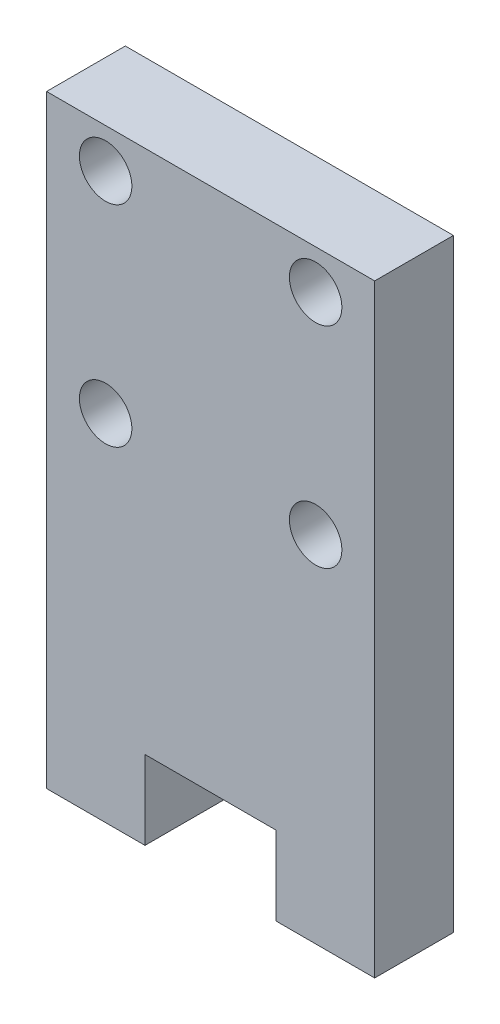
ISO-10303-21;
HEADER;
FILE_DESCRIPTION(('STEP AP214'),'2;1');
FILE_NAME('part.step','',(''),(''),'','','');
FILE_SCHEMA(('AUTOMOTIVE_DESIGN { 1 0 10303 214 1 1 1 1 }'));
ENDSEC;
DATA;
#1=APPLICATION_CONTEXT('core data for automotive mechanical design processes');
#2=APPLICATION_PROTOCOL_DEFINITION('international standard','automotive_design',2000,#1);
#3=PRODUCT_CONTEXT('',#1,'mechanical');
#4=PRODUCT('Part','Part','',(#3));
#5=PRODUCT_RELATED_PRODUCT_CATEGORY('part','',(#4));
#6=PRODUCT_DEFINITION_FORMATION('','',#4);
#7=PRODUCT_DEFINITION_CONTEXT('part definition',#1,'design');
#8=PRODUCT_DEFINITION('design','',#6,#7);
#9=PRODUCT_DEFINITION_SHAPE('','',#8);
#10=(LENGTH_UNIT() NAMED_UNIT(*) SI_UNIT(.MILLI.,.METRE.));
#11=(NAMED_UNIT(*) PLANE_ANGLE_UNIT() SI_UNIT($,.RADIAN.));
#12=(NAMED_UNIT(*) SI_UNIT($,.STERADIAN.) SOLID_ANGLE_UNIT());
#13=UNCERTAINTY_MEASURE_WITH_UNIT(LENGTH_MEASURE(1.E-05),#10,'distance_accuracy_value','');
#14=(GEOMETRIC_REPRESENTATION_CONTEXT(3) GLOBAL_UNCERTAINTY_ASSIGNED_CONTEXT((#13)) GLOBAL_UNIT_ASSIGNED_CONTEXT((#10,
#11,#12)) REPRESENTATION_CONTEXT('',''));
#15=CARTESIAN_POINT('',(0.,0.,0.));
#16=DIRECTION('',(0.,0.,1.));
#17=DIRECTION('',(1.,0.,0.));
#18=AXIS2_PLACEMENT_3D('',#15,#16,#17);
#19=CARTESIAN_POINT('',(0.,0.,6.));
#20=DIRECTION('',(0.,1.,0.));
#21=DIRECTION('',(0.,0.,1.));
#22=AXIS2_PLACEMENT_3D('',#19,#20,#21);
#23=PLANE('',#22);
#24=DIRECTION('',(0.,0.,-1.));
#25=VECTOR('',#24,1.);
#26=CARTESIAN_POINT('',(17.5,0.,0.));
#27=LINE('',#26,#25);
#28=CARTESIAN_POINT('',(17.5,0.,6.));
#29=VERTEX_POINT('',#28);
#30=CARTESIAN_POINT('',(17.5,0.,0.));
#31=VERTEX_POINT('',#30);
#32=EDGE_CURVE('E52',#29,#31,#27,.T.);
#33=ORIENTED_EDGE('',*,*,#32,.F.);
#34=DIRECTION('',(1.,0.,0.));
#35=VECTOR('',#34,1.);
#36=CARTESIAN_POINT('',(0.,0.,6.));
#37=LINE('',#36,#35);
#38=CARTESIAN_POINT('',(7.5,0.,6.));
#39=VERTEX_POINT('',#38);
#40=EDGE_CURVE('E108',#39,#29,#37,.T.);
#41=ORIENTED_EDGE('',*,*,#40,.F.);
#42=DIRECTION('',(0.,0.,1.));
#43=VECTOR('',#42,1.);
#44=CARTESIAN_POINT('',(7.5,0.,0.));
#45=LINE('',#44,#43);
#46=CARTESIAN_POINT('',(7.5,0.,0.));
#47=VERTEX_POINT('',#46);
#48=EDGE_CURVE('E132',#47,#39,#45,.T.);
#49=ORIENTED_EDGE('',*,*,#48,.F.);
#50=DIRECTION('',(1.,0.,0.));
#51=VECTOR('',#50,1.);
#52=CARTESIAN_POINT('',(0.,0.,0.));
#53=LINE('',#52,#51);
#54=EDGE_CURVE('E57',#47,#31,#53,.T.);
#55=ORIENTED_EDGE('',*,*,#54,.T.);
#56=EDGE_LOOP('',(#33,#41,#49,#55));
#57=FACE_BOUND('',#56,.T.);
#58=ADVANCED_FACE('F35',(#57),#23,.F.);
#59=CARTESIAN_POINT('',(20.5,21.,0.));
#60=DIRECTION('',(0.,0.,1.));
#61=DIRECTION('',(1.,0.,0.));
#62=AXIS2_PLACEMENT_3D('',#59,#60,#61);
#63=CYLINDRICAL_SURFACE('',#62,1.005);
#64=CARTESIAN_POINT('',(20.5,21.,0.));
#65=DIRECTION('',(0.,0.,1.));
#66=DIRECTION('',(1.,0.,0.));
#67=AXIS2_PLACEMENT_3D('',#64,#65,#66);
#68=CIRCLE('',#67,1.005);
#69=CARTESIAN_POINT('',(21.505,21.,0.));
#70=VERTEX_POINT('',#69);
#71=EDGE_CURVE('E190',#70,#70,#68,.T.);
#72=ORIENTED_EDGE('',*,*,#71,.F.);
#73=EDGE_LOOP('',(#72));
#74=FACE_BOUND('',#73,.T.);
#75=CARTESIAN_POINT('',(20.5,21.,3.));
#76=DIRECTION('',(0.,0.,1.));
#77=DIRECTION('',(1.,0.,0.));
#78=AXIS2_PLACEMENT_3D('',#75,#76,#77);
#79=CIRCLE('',#78,1.005);
#80=CARTESIAN_POINT('',(21.505,21.,3.));
#81=VERTEX_POINT('',#80);
#82=EDGE_CURVE('E167',#81,#81,#79,.F.);
#83=ORIENTED_EDGE('',*,*,#82,.F.);
#84=EDGE_LOOP('',(#83));
#85=FACE_BOUND('',#84,.T.);
#86=ADVANCED_FACE('F251',(#74,#85),#63,.F.);
#87=CARTESIAN_POINT('',(4.5,21.,0.));
#88=DIRECTION('',(0.,0.,1.));
#89=DIRECTION('',(1.,0.,0.));
#90=AXIS2_PLACEMENT_3D('',#87,#88,#89);
#91=CYLINDRICAL_SURFACE('',#90,1.005);
#92=CARTESIAN_POINT('',(4.5,21.,0.));
#93=DIRECTION('',(0.,0.,1.));
#94=DIRECTION('',(1.,0.,0.));
#95=AXIS2_PLACEMENT_3D('',#92,#93,#94);
#96=CIRCLE('',#95,1.005);
#97=CARTESIAN_POINT('',(5.505,21.,0.));
#98=VERTEX_POINT('',#97);
#99=EDGE_CURVE('E193',#98,#98,#96,.T.);
#100=ORIENTED_EDGE('',*,*,#99,.F.);
#101=EDGE_LOOP('',(#100));
#102=FACE_BOUND('',#101,.T.);
#103=CARTESIAN_POINT('',(4.5,21.,3.));
#104=DIRECTION('',(0.,0.,1.));
#105=DIRECTION('',(1.,0.,0.));
#106=AXIS2_PLACEMENT_3D('',#103,#104,#105);
#107=CIRCLE('',#106,1.005);
#108=CARTESIAN_POINT('',(5.505,21.,3.));
#109=VERTEX_POINT('',#108);
#110=EDGE_CURVE('E172',#109,#109,#107,.F.);
#111=ORIENTED_EDGE('',*,*,#110,.F.);
#112=EDGE_LOOP('',(#111));
#113=FACE_BOUND('',#112,.T.);
#114=ADVANCED_FACE('F255',(#102,#113),#91,.F.);
#115=CARTESIAN_POINT('',(20.5,37.,0.));
#116=DIRECTION('',(0.,0.,1.));
#117=DIRECTION('',(1.,0.,0.));
#118=AXIS2_PLACEMENT_3D('',#115,#116,#117);
#119=CYLINDRICAL_SURFACE('',#118,1.005);
#120=CARTESIAN_POINT('',(20.5,37.,0.));
#121=DIRECTION('',(0.,0.,1.));
#122=DIRECTION('',(1.,0.,0.));
#123=AXIS2_PLACEMENT_3D('',#120,#121,#122);
#124=CIRCLE('',#123,1.005);
#125=CARTESIAN_POINT('',(21.505,37.,0.));
#126=VERTEX_POINT('',#125);
#127=EDGE_CURVE('E196',#126,#126,#124,.T.);
#128=ORIENTED_EDGE('',*,*,#127,.F.);
#129=EDGE_LOOP('',(#128));
#130=FACE_BOUND('',#129,.T.);
#131=CARTESIAN_POINT('',(20.5,37.,3.));
#132=DIRECTION('',(0.,0.,1.));
#133=DIRECTION('',(1.,0.,0.));
#134=AXIS2_PLACEMENT_3D('',#131,#132,#133);
#135=CIRCLE('',#134,1.005);
#136=CARTESIAN_POINT('',(21.505,37.,3.));
#137=VERTEX_POINT('',#136);
#138=EDGE_CURVE('E179',#137,#137,#135,.F.);
#139=ORIENTED_EDGE('',*,*,#138,.F.);
#140=EDGE_LOOP('',(#139));
#141=FACE_BOUND('',#140,.T.);
#142=ADVANCED_FACE('F273',(#130,#141),#119,.F.);
#143=CARTESIAN_POINT('',(4.5,37.,0.));
#144=DIRECTION('',(0.,0.,1.));
#145=DIRECTION('',(1.,0.,0.));
#146=AXIS2_PLACEMENT_3D('',#143,#144,#145);
#147=CYLINDRICAL_SURFACE('',#146,1.005);
#148=CARTESIAN_POINT('',(4.5,37.,0.));
#149=DIRECTION('',(0.,0.,1.));
#150=DIRECTION('',(1.,0.,0.));
#151=AXIS2_PLACEMENT_3D('',#148,#149,#150);
#152=CIRCLE('',#151,1.005);
#153=CARTESIAN_POINT('',(5.505,37.,0.));
#154=VERTEX_POINT('',#153);
#155=EDGE_CURVE('E199',#154,#154,#152,.T.);
#156=ORIENTED_EDGE('',*,*,#155,.F.);
#157=EDGE_LOOP('',(#156));
#158=FACE_BOUND('',#157,.T.);
#159=CARTESIAN_POINT('',(4.5,37.,3.));
#160=DIRECTION('',(0.,0.,1.));
#161=DIRECTION('',(1.,0.,0.));
#162=AXIS2_PLACEMENT_3D('',#159,#160,#161);
#163=CIRCLE('',#162,1.005);
#164=CARTESIAN_POINT('',(5.505,37.,3.));
#165=VERTEX_POINT('',#164);
#166=EDGE_CURVE('E186',#165,#165,#163,.F.);
#167=ORIENTED_EDGE('',*,*,#166,.F.);
#168=EDGE_LOOP('',(#167));
#169=FACE_BOUND('',#168,.T.);
#170=ADVANCED_FACE('F270',(#158,#169),#147,.F.);
#171=CARTESIAN_POINT('',(0.,0.,6.));
#172=DIRECTION('',(1.,0.,0.));
#173=DIRECTION('',(0.,0.,-1.));
#174=AXIS2_PLACEMENT_3D('',#171,#172,#173);
#175=PLANE('',#174);
#176=DIRECTION('',(0.,-1.,0.));
#177=VECTOR('',#176,1.);
#178=CARTESIAN_POINT('',(0.,0.,0.));
#179=LINE('',#178,#177);
#180=CARTESIAN_POINT('',(0.,40.,0.));
#181=VERTEX_POINT('',#180);
#182=CARTESIAN_POINT('',(0.,-6.,0.));
#183=VERTEX_POINT('',#182);
#184=EDGE_CURVE('E202',#181,#183,#179,.T.);
#185=ORIENTED_EDGE('',*,*,#184,.T.);
#186=DIRECTION('',(0.,0.,-1.));
#187=VECTOR('',#186,1.);
#188=CARTESIAN_POINT('',(0.,-6.,0.));
#189=LINE('',#188,#187);
#190=CARTESIAN_POINT('',(0.,-6.,6.));
#191=VERTEX_POINT('',#190);
#192=EDGE_CURVE('E133',#191,#183,#189,.T.);
#193=ORIENTED_EDGE('',*,*,#192,.F.);
#194=DIRECTION('',(0.,-1.,0.));
#195=VECTOR('',#194,1.);
#196=CARTESIAN_POINT('',(0.,0.,6.));
#197=LINE('',#196,#195);
#198=CARTESIAN_POINT('',(0.,40.,6.));
#199=VERTEX_POINT('',#198);
#200=EDGE_CURVE('E203',#199,#191,#197,.T.);
#201=ORIENTED_EDGE('',*,*,#200,.F.);
#202=DIRECTION('',(0.,0.,-1.));
#203=VECTOR('',#202,1.);
#204=CARTESIAN_POINT('',(0.,40.,6.));
#205=LINE('',#204,#203);
#206=EDGE_CURVE('E44',#199,#181,#205,.T.);
#207=ORIENTED_EDGE('',*,*,#206,.T.);
#208=EDGE_LOOP('',(#185,#193,#201,#207));
#209=FACE_BOUND('',#208,.T.);
#210=ADVANCED_FACE('F37',(#209),#175,.F.);
#211=CARTESIAN_POINT('',(25.,0.,6.));
#212=DIRECTION('',(-1.,0.,0.));
#213=DIRECTION('',(0.,0.,1.));
#214=AXIS2_PLACEMENT_3D('',#211,#212,#213);
#215=PLANE('',#214);
#216=DIRECTION('',(0.,1.,0.));
#217=VECTOR('',#216,1.);
#218=CARTESIAN_POINT('',(25.,0.,0.));
#219=LINE('',#218,#217);
#220=CARTESIAN_POINT('',(25.,-6.,0.));
#221=VERTEX_POINT('',#220);
#222=CARTESIAN_POINT('',(25.,40.,0.));
#223=VERTEX_POINT('',#222);
#224=EDGE_CURVE('E211',#221,#223,#219,.T.);
#225=ORIENTED_EDGE('',*,*,#224,.T.);
#226=DIRECTION('',(0.,0.,-1.));
#227=VECTOR('',#226,1.);
#228=CARTESIAN_POINT('',(25.,40.,6.));
#229=LINE('',#228,#227);
#230=CARTESIAN_POINT('',(25.,40.,6.));
#231=VERTEX_POINT('',#230);
#232=EDGE_CURVE('E11',#231,#223,#229,.T.);
#233=ORIENTED_EDGE('',*,*,#232,.F.);
#234=DIRECTION('',(0.,1.,0.));
#235=VECTOR('',#234,1.);
#236=CARTESIAN_POINT('',(25.,0.,6.));
#237=LINE('',#236,#235);
#238=CARTESIAN_POINT('',(25.,-6.,6.));
#239=VERTEX_POINT('',#238);
#240=EDGE_CURVE('E100',#239,#231,#237,.T.);
#241=ORIENTED_EDGE('',*,*,#240,.F.);
#242=DIRECTION('',(0.,0.,1.));
#243=VECTOR('',#242,1.);
#244=CARTESIAN_POINT('',(25.,-6.,0.));
#245=LINE('',#244,#243);
#246=EDGE_CURVE('E104',#221,#239,#245,.T.);
#247=ORIENTED_EDGE('',*,*,#246,.F.);
#248=EDGE_LOOP('',(#225,#233,#241,#247));
#249=FACE_BOUND('',#248,.T.);
#250=ADVANCED_FACE('F102',(#249),#215,.F.);
#251=CARTESIAN_POINT('',(0.,40.,6.));
#252=DIRECTION('',(0.,-1.,0.));
#253=DIRECTION('',(0.,0.,-1.));
#254=AXIS2_PLACEMENT_3D('',#251,#252,#253);
#255=PLANE('',#254);
#256=DIRECTION('',(-1.,0.,0.));
#257=VECTOR('',#256,1.);
#258=CARTESIAN_POINT('',(0.,40.,0.));
#259=LINE('',#258,#257);
#260=EDGE_CURVE('E204',#223,#181,#259,.T.);
#261=ORIENTED_EDGE('',*,*,#260,.T.);
#262=ORIENTED_EDGE('',*,*,#206,.F.);
#263=DIRECTION('',(-1.,0.,0.));
#264=VECTOR('',#263,1.);
#265=CARTESIAN_POINT('',(0.,40.,6.));
#266=LINE('',#265,#264);
#267=EDGE_CURVE('E107',#231,#199,#266,.T.);
#268=ORIENTED_EDGE('',*,*,#267,.F.);
#269=ORIENTED_EDGE('',*,*,#232,.T.);
#270=EDGE_LOOP('',(#261,#262,#268,#269));
#271=FACE_BOUND('',#270,.T.);
#272=ADVANCED_FACE('F227',(#271),#255,.F.);
#273=CARTESIAN_POINT('',(0.,0.,6.));
#274=DIRECTION('',(0.,0.,-1.));
#275=DIRECTION('',(-1.,0.,0.));
#276=AXIS2_PLACEMENT_3D('',#273,#274,#275);
#277=PLANE('',#276);
#278=CARTESIAN_POINT('',(20.5,21.,6.));
#279=DIRECTION('',(0.,0.,1.));
#280=DIRECTION('',(1.,0.,0.));
#281=AXIS2_PLACEMENT_3D('',#278,#279,#280);
#282=CIRCLE('',#281,2.);
#283=CARTESIAN_POINT('',(22.5,21.,6.));
#284=VERTEX_POINT('',#283);
#285=EDGE_CURVE('E159',#284,#284,#282,.T.);
#286=ORIENTED_EDGE('',*,*,#285,.F.);
#287=EDGE_LOOP('',(#286));
#288=FACE_BOUND('',#287,.T.);
#289=CARTESIAN_POINT('',(4.5,21.,6.));
#290=DIRECTION('',(0.,0.,1.));
#291=DIRECTION('',(1.,0.,0.));
#292=AXIS2_PLACEMENT_3D('',#289,#290,#291);
#293=CIRCLE('',#292,2.);
#294=CARTESIAN_POINT('',(6.5,21.,6.));
#295=VERTEX_POINT('',#294);
#296=EDGE_CURVE('E173',#295,#295,#293,.T.);
#297=ORIENTED_EDGE('',*,*,#296,.F.);
#298=EDGE_LOOP('',(#297));
#299=FACE_BOUND('',#298,.T.);
#300=CARTESIAN_POINT('',(20.5,37.,6.));
#301=DIRECTION('',(0.,0.,1.));
#302=DIRECTION('',(1.,0.,0.));
#303=AXIS2_PLACEMENT_3D('',#300,#301,#302);
#304=CIRCLE('',#303,2.);
#305=CARTESIAN_POINT('',(22.5,37.,6.));
#306=VERTEX_POINT('',#305);
#307=EDGE_CURVE('E180',#306,#306,#304,.T.);
#308=ORIENTED_EDGE('',*,*,#307,.F.);
#309=EDGE_LOOP('',(#308));
#310=FACE_BOUND('',#309,.T.);
#311=CARTESIAN_POINT('',(4.5,37.,6.));
#312=DIRECTION('',(0.,0.,1.));
#313=DIRECTION('',(1.,0.,0.));
#314=AXIS2_PLACEMENT_3D('',#311,#312,#313);
#315=CIRCLE('',#314,2.);
#316=CARTESIAN_POINT('',(6.5,37.,6.));
#317=VERTEX_POINT('',#316);
#318=EDGE_CURVE('E187',#317,#317,#315,.T.);
#319=ORIENTED_EDGE('',*,*,#318,.F.);
#320=EDGE_LOOP('',(#319));
#321=FACE_BOUND('',#320,.T.);
#322=ORIENTED_EDGE('',*,*,#200,.T.);
#323=DIRECTION('',(-1.,0.,0.));
#324=VECTOR('',#323,1.);
#325=CARTESIAN_POINT('',(0.,-6.,6.));
#326=LINE('',#325,#324);
#327=CARTESIAN_POINT('',(7.5,-6.,6.));
#328=VERTEX_POINT('',#327);
#329=EDGE_CURVE('E140',#328,#191,#326,.T.);
#330=ORIENTED_EDGE('',*,*,#329,.F.);
#331=DIRECTION('',(0.,1.,0.));
#332=VECTOR('',#331,1.);
#333=CARTESIAN_POINT('',(7.5,-6.,6.));
#334=LINE('',#333,#332);
#335=EDGE_CURVE('E143',#328,#39,#334,.T.);
#336=ORIENTED_EDGE('',*,*,#335,.T.);
#337=ORIENTED_EDGE('',*,*,#40,.T.);
#338=DIRECTION('',(0.,1.,0.));
#339=VECTOR('',#338,1.);
#340=CARTESIAN_POINT('',(17.5,-6.,6.));
#341=LINE('',#340,#339);
#342=CARTESIAN_POINT('',(17.5,-6.,6.));
#343=VERTEX_POINT('',#342);
#344=EDGE_CURVE('E114',#343,#29,#341,.T.);
#345=ORIENTED_EDGE('',*,*,#344,.F.);
#346=DIRECTION('',(-1.,0.,0.));
#347=VECTOR('',#346,1.);
#348=CARTESIAN_POINT('',(25.,-6.,6.));
#349=LINE('',#348,#347);
#350=EDGE_CURVE('E111',#239,#343,#349,.T.);
#351=ORIENTED_EDGE('',*,*,#350,.F.);
#352=ORIENTED_EDGE('',*,*,#240,.T.);
#353=ORIENTED_EDGE('',*,*,#267,.T.);
#354=EDGE_LOOP('',(#322,#330,#336,#337,#345,#351,#352,#353));
#355=FACE_BOUND('',#354,.T.);
#356=ADVANCED_FACE('F112',(#288,#299,#310,#321,#355),#277,.F.);
#357=CARTESIAN_POINT('',(0.,0.,0.));
#358=DIRECTION('',(0.,0.,-1.));
#359=DIRECTION('',(-1.,0.,0.));
#360=AXIS2_PLACEMENT_3D('',#357,#358,#359);
#361=PLANE('',#360);
#362=ORIENTED_EDGE('',*,*,#71,.T.);
#363=EDGE_LOOP('',(#362));
#364=FACE_BOUND('',#363,.T.);
#365=ORIENTED_EDGE('',*,*,#99,.T.);
#366=EDGE_LOOP('',(#365));
#367=FACE_BOUND('',#366,.T.);
#368=ORIENTED_EDGE('',*,*,#127,.T.);
#369=EDGE_LOOP('',(#368));
#370=FACE_BOUND('',#369,.T.);
#371=ORIENTED_EDGE('',*,*,#155,.T.);
#372=EDGE_LOOP('',(#371));
#373=FACE_BOUND('',#372,.T.);
#374=ORIENTED_EDGE('',*,*,#184,.F.);
#375=ORIENTED_EDGE('',*,*,#260,.F.);
#376=ORIENTED_EDGE('',*,*,#224,.F.);
#377=DIRECTION('',(1.,0.,0.));
#378=VECTOR('',#377,1.);
#379=CARTESIAN_POINT('',(25.,-6.,0.));
#380=LINE('',#379,#378);
#381=CARTESIAN_POINT('',(17.5,-6.,0.));
#382=VERTEX_POINT('',#381);
#383=EDGE_CURVE('E122',#382,#221,#380,.T.);
#384=ORIENTED_EDGE('',*,*,#383,.F.);
#385=DIRECTION('',(0.,1.,0.));
#386=VECTOR('',#385,1.);
#387=CARTESIAN_POINT('',(17.5,-6.,0.));
#388=LINE('',#387,#386);
#389=EDGE_CURVE('E127',#382,#31,#388,.T.);
#390=ORIENTED_EDGE('',*,*,#389,.T.);
#391=ORIENTED_EDGE('',*,*,#54,.F.);
#392=DIRECTION('',(0.,1.,0.));
#393=VECTOR('',#392,1.);
#394=CARTESIAN_POINT('',(7.5,-6.,0.));
#395=LINE('',#394,#393);
#396=CARTESIAN_POINT('',(7.5,-6.,0.));
#397=VERTEX_POINT('',#396);
#398=EDGE_CURVE('E156',#397,#47,#395,.T.);
#399=ORIENTED_EDGE('',*,*,#398,.F.);
#400=DIRECTION('',(1.,0.,0.));
#401=VECTOR('',#400,1.);
#402=CARTESIAN_POINT('',(0.,-6.,0.));
#403=LINE('',#402,#401);
#404=EDGE_CURVE('E136',#183,#397,#403,.T.);
#405=ORIENTED_EDGE('',*,*,#404,.F.);
#406=EDGE_LOOP('',(#374,#375,#376,#384,#390,#391,#399,#405));
#407=FACE_BOUND('',#406,.T.);
#408=ADVANCED_FACE('F229',(#364,#367,#370,#373,#407),#361,.T.);
#409=CARTESIAN_POINT('',(4.5,37.,3.));
#410=DIRECTION('',(0.,0.,1.));
#411=DIRECTION('',(1.,0.,0.));
#412=AXIS2_PLACEMENT_3D('',#409,#410,#411);
#413=PLANE('',#412);
#414=CARTESIAN_POINT('',(4.5,37.,3.));
#415=DIRECTION('',(0.,0.,1.));
#416=DIRECTION('',(1.,0.,0.));
#417=AXIS2_PLACEMENT_3D('',#414,#415,#416);
#418=CIRCLE('',#417,2.);
#419=CARTESIAN_POINT('',(6.5,37.,3.));
#420=VERTEX_POINT('',#419);
#421=EDGE_CURVE('E183',#420,#420,#418,.T.);
#422=ORIENTED_EDGE('',*,*,#421,.T.);
#423=EDGE_LOOP('',(#422));
#424=FACE_BOUND('',#423,.T.);
#425=ORIENTED_EDGE('',*,*,#166,.T.);
#426=EDGE_LOOP('',(#425));
#427=FACE_BOUND('',#426,.T.);
#428=ADVANCED_FACE('F265',(#424,#427),#413,.T.);
#429=CARTESIAN_POINT('',(4.5,37.,3.));
#430=DIRECTION('',(0.,0.,1.));
#431=DIRECTION('',(1.,0.,0.));
#432=AXIS2_PLACEMENT_3D('',#429,#430,#431);
#433=CYLINDRICAL_SURFACE('',#432,2.);
#434=ORIENTED_EDGE('',*,*,#421,.F.);
#435=EDGE_LOOP('',(#434));
#436=FACE_BOUND('',#435,.T.);
#437=ORIENTED_EDGE('',*,*,#318,.T.);
#438=EDGE_LOOP('',(#437));
#439=FACE_BOUND('',#438,.T.);
#440=ADVANCED_FACE('F281',(#436,#439),#433,.F.);
#441=CARTESIAN_POINT('',(20.5,37.,3.));
#442=DIRECTION('',(0.,0.,1.));
#443=DIRECTION('',(1.,0.,0.));
#444=AXIS2_PLACEMENT_3D('',#441,#442,#443);
#445=PLANE('',#444);
#446=CARTESIAN_POINT('',(20.5,37.,3.));
#447=DIRECTION('',(0.,0.,1.));
#448=DIRECTION('',(1.,0.,0.));
#449=AXIS2_PLACEMENT_3D('',#446,#447,#448);
#450=CIRCLE('',#449,2.);
#451=CARTESIAN_POINT('',(22.5,37.,3.));
#452=VERTEX_POINT('',#451);
#453=EDGE_CURVE('E176',#452,#452,#450,.T.);
#454=ORIENTED_EDGE('',*,*,#453,.T.);
#455=EDGE_LOOP('',(#454));
#456=FACE_BOUND('',#455,.T.);
#457=ORIENTED_EDGE('',*,*,#138,.T.);
#458=EDGE_LOOP('',(#457));
#459=FACE_BOUND('',#458,.T.);
#460=ADVANCED_FACE('F284',(#456,#459),#445,.T.);
#461=CARTESIAN_POINT('',(20.5,37.,3.));
#462=DIRECTION('',(0.,0.,1.));
#463=DIRECTION('',(1.,0.,0.));
#464=AXIS2_PLACEMENT_3D('',#461,#462,#463);
#465=CYLINDRICAL_SURFACE('',#464,2.);
#466=ORIENTED_EDGE('',*,*,#453,.F.);
#467=EDGE_LOOP('',(#466));
#468=FACE_BOUND('',#467,.T.);
#469=ORIENTED_EDGE('',*,*,#307,.T.);
#470=EDGE_LOOP('',(#469));
#471=FACE_BOUND('',#470,.T.);
#472=ADVANCED_FACE('F289',(#468,#471),#465,.F.);
#473=CARTESIAN_POINT('',(4.5,21.,3.));
#474=DIRECTION('',(0.,0.,1.));
#475=DIRECTION('',(1.,0.,0.));
#476=AXIS2_PLACEMENT_3D('',#473,#474,#475);
#477=PLANE('',#476);
#478=CARTESIAN_POINT('',(4.5,21.,3.));
#479=DIRECTION('',(0.,0.,1.));
#480=DIRECTION('',(1.,0.,0.));
#481=AXIS2_PLACEMENT_3D('',#478,#479,#480);
#482=CIRCLE('',#481,2.);
#483=CARTESIAN_POINT('',(6.5,21.,3.));
#484=VERTEX_POINT('',#483);
#485=EDGE_CURVE('E169',#484,#484,#482,.T.);
#486=ORIENTED_EDGE('',*,*,#485,.T.);
#487=EDGE_LOOP('',(#486));
#488=FACE_BOUND('',#487,.T.);
#489=ORIENTED_EDGE('',*,*,#110,.T.);
#490=EDGE_LOOP('',(#489));
#491=FACE_BOUND('',#490,.T.);
#492=ADVANCED_FACE('F292',(#488,#491),#477,.T.);
#493=CARTESIAN_POINT('',(4.5,21.,3.));
#494=DIRECTION('',(0.,0.,1.));
#495=DIRECTION('',(1.,0.,0.));
#496=AXIS2_PLACEMENT_3D('',#493,#494,#495);
#497=CYLINDRICAL_SURFACE('',#496,2.);
#498=ORIENTED_EDGE('',*,*,#485,.F.);
#499=EDGE_LOOP('',(#498));
#500=FACE_BOUND('',#499,.T.);
#501=ORIENTED_EDGE('',*,*,#296,.T.);
#502=EDGE_LOOP('',(#501));
#503=FACE_BOUND('',#502,.T.);
#504=ADVANCED_FACE('F297',(#500,#503),#497,.F.);
#505=CARTESIAN_POINT('',(20.5,21.,3.));
#506=DIRECTION('',(0.,0.,1.));
#507=DIRECTION('',(1.,0.,0.));
#508=AXIS2_PLACEMENT_3D('',#505,#506,#507);
#509=PLANE('',#508);
#510=CARTESIAN_POINT('',(20.5,21.,3.));
#511=DIRECTION('',(0.,0.,1.));
#512=DIRECTION('',(1.,0.,0.));
#513=AXIS2_PLACEMENT_3D('',#510,#511,#512);
#514=CIRCLE('',#513,2.);
#515=CARTESIAN_POINT('',(22.5,21.,3.));
#516=VERTEX_POINT('',#515);
#517=EDGE_CURVE('E146',#516,#516,#514,.T.);
#518=ORIENTED_EDGE('',*,*,#517,.T.);
#519=EDGE_LOOP('',(#518));
#520=FACE_BOUND('',#519,.T.);
#521=ORIENTED_EDGE('',*,*,#82,.T.);
#522=EDGE_LOOP('',(#521));
#523=FACE_BOUND('',#522,.T.);
#524=ADVANCED_FACE('F300',(#520,#523),#509,.T.);
#525=CARTESIAN_POINT('',(20.5,21.,3.));
#526=DIRECTION('',(0.,0.,1.));
#527=DIRECTION('',(1.,0.,0.));
#528=AXIS2_PLACEMENT_3D('',#525,#526,#527);
#529=CYLINDRICAL_SURFACE('',#528,2.);
#530=ORIENTED_EDGE('',*,*,#517,.F.);
#531=EDGE_LOOP('',(#530));
#532=FACE_BOUND('',#531,.T.);
#533=ORIENTED_EDGE('',*,*,#285,.T.);
#534=EDGE_LOOP('',(#533));
#535=FACE_BOUND('',#534,.T.);
#536=ADVANCED_FACE('F305',(#532,#535),#529,.F.);
#537=CARTESIAN_POINT('',(7.5,-6.,0.));
#538=DIRECTION('',(-1.,0.,0.));
#539=DIRECTION('',(0.,0.,1.));
#540=AXIS2_PLACEMENT_3D('',#537,#538,#539);
#541=PLANE('',#540);
#542=ORIENTED_EDGE('',*,*,#48,.T.);
#543=ORIENTED_EDGE('',*,*,#335,.F.);
#544=DIRECTION('',(0.,0.,1.));
#545=VECTOR('',#544,1.);
#546=CARTESIAN_POINT('',(7.5,-6.,0.));
#547=LINE('',#546,#545);
#548=EDGE_CURVE('E138',#397,#328,#547,.T.);
#549=ORIENTED_EDGE('',*,*,#548,.F.);
#550=ORIENTED_EDGE('',*,*,#398,.T.);
#551=EDGE_LOOP('',(#542,#543,#549,#550));
#552=FACE_BOUND('',#551,.T.);
#553=ADVANCED_FACE('F238',(#552),#541,.F.);
#554=CARTESIAN_POINT('',(0.,-6.,0.));
#555=DIRECTION('',(0.,1.,0.));
#556=DIRECTION('',(0.,0.,1.));
#557=AXIS2_PLACEMENT_3D('',#554,#555,#556);
#558=PLANE('',#557);
#559=ORIENTED_EDGE('',*,*,#192,.T.);
#560=ORIENTED_EDGE('',*,*,#404,.T.);
#561=ORIENTED_EDGE('',*,*,#548,.T.);
#562=ORIENTED_EDGE('',*,*,#329,.T.);
#563=EDGE_LOOP('',(#559,#560,#561,#562));
#564=FACE_BOUND('',#563,.T.);
#565=ADVANCED_FACE('F236',(#564),#558,.F.);
#566=CARTESIAN_POINT('',(17.5,-6.,0.));
#567=DIRECTION('',(1.,0.,0.));
#568=DIRECTION('',(0.,0.,-1.));
#569=AXIS2_PLACEMENT_3D('',#566,#567,#568);
#570=PLANE('',#569);
#571=ORIENTED_EDGE('',*,*,#32,.T.);
#572=ORIENTED_EDGE('',*,*,#389,.F.);
#573=DIRECTION('',(0.,0.,-1.));
#574=VECTOR('',#573,1.);
#575=CARTESIAN_POINT('',(17.5,-6.,0.));
#576=LINE('',#575,#574);
#577=EDGE_CURVE('E117',#343,#382,#576,.T.);
#578=ORIENTED_EDGE('',*,*,#577,.F.);
#579=ORIENTED_EDGE('',*,*,#344,.T.);
#580=EDGE_LOOP('',(#571,#572,#578,#579));
#581=FACE_BOUND('',#580,.T.);
#582=ADVANCED_FACE('F240',(#581),#570,.F.);
#583=CARTESIAN_POINT('',(0.,-6.,0.));
#584=DIRECTION('',(0.,-1.,0.));
#585=DIRECTION('',(0.,0.,-1.));
#586=AXIS2_PLACEMENT_3D('',#583,#584,#585);
#587=PLANE('',#586);
#588=ORIENTED_EDGE('',*,*,#246,.T.);
#589=ORIENTED_EDGE('',*,*,#350,.T.);
#590=ORIENTED_EDGE('',*,*,#577,.T.);
#591=ORIENTED_EDGE('',*,*,#383,.T.);
#592=EDGE_LOOP('',(#588,#589,#590,#591));
#593=FACE_BOUND('',#592,.T.);
#594=ADVANCED_FACE('F120',(#593),#587,.T.);
#595=CLOSED_SHELL('',(#58,#86,#114,#142,#170,#210,#250,#272,#356,#408,#428,#440,#460,#472,#492,
#504,#524,#536,#553,#565,#582,#594));
#596=MANIFOLD_SOLID_BREP('B2',#595);
#597=ADVANCED_BREP_SHAPE_REPRESENTATION('',(#18,#596),#14);
#598=SHAPE_DEFINITION_REPRESENTATION(#9,#597);
ENDSEC;
END-ISO-10303-21;
